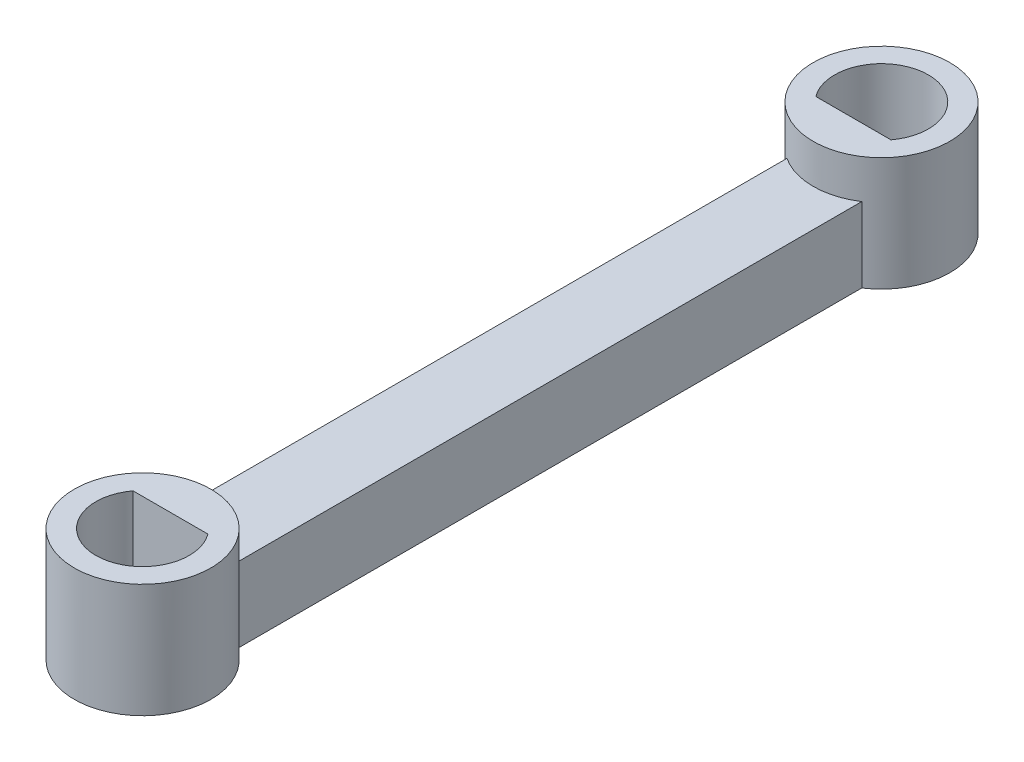
ISO-10303-21;
HEADER;
FILE_DESCRIPTION(('STEP AP214'),'2;1');
FILE_NAME('part.step','',(''),(''),'','','');
FILE_SCHEMA(('AUTOMOTIVE_DESIGN { 1 0 10303 214 1 1 1 1 }'));
ENDSEC;
DATA;
#1=APPLICATION_CONTEXT('core data for automotive mechanical design processes');
#2=APPLICATION_PROTOCOL_DEFINITION('international standard','automotive_design',2000,#1);
#3=PRODUCT_CONTEXT('',#1,'mechanical');
#4=PRODUCT('Part','Part','',(#3));
#5=PRODUCT_RELATED_PRODUCT_CATEGORY('part','',(#4));
#6=PRODUCT_DEFINITION_FORMATION('','',#4);
#7=PRODUCT_DEFINITION_CONTEXT('part definition',#1,'design');
#8=PRODUCT_DEFINITION('design','',#6,#7);
#9=PRODUCT_DEFINITION_SHAPE('','',#8);
#10=(LENGTH_UNIT() NAMED_UNIT(*) SI_UNIT(.MILLI.,.METRE.));
#11=(NAMED_UNIT(*) PLANE_ANGLE_UNIT() SI_UNIT($,.RADIAN.));
#12=(NAMED_UNIT(*) SI_UNIT($,.STERADIAN.) SOLID_ANGLE_UNIT());
#13=UNCERTAINTY_MEASURE_WITH_UNIT(LENGTH_MEASURE(1.E-05),#10,'distance_accuracy_value','');
#14=(GEOMETRIC_REPRESENTATION_CONTEXT(3) GLOBAL_UNCERTAINTY_ASSIGNED_CONTEXT((#13)) GLOBAL_UNIT_ASSIGNED_CONTEXT((#10,
#11,#12)) REPRESENTATION_CONTEXT('',''));
#15=CARTESIAN_POINT('',(0.,0.,0.));
#16=DIRECTION('',(0.,0.,1.));
#17=DIRECTION('',(1.,0.,0.));
#18=AXIS2_PLACEMENT_3D('',#15,#16,#17);
#19=CARTESIAN_POINT('',(0.,10.,0.));
#20=DIRECTION('',(0.,1.,0.));
#21=DIRECTION('',(0.,0.,1.));
#22=AXIS2_PLACEMENT_3D('',#19,#20,#21);
#23=PLANE('',#22);
#24=CARTESIAN_POINT('',(0.,10.,0.));
#25=DIRECTION('',(0.,1.,0.));
#26=DIRECTION('',(0.,0.,1.));
#27=AXIS2_PLACEMENT_3D('',#24,#25,#26);
#28=CIRCLE('',#27,6.);
#29=CARTESIAN_POINT('',(0.,10.,6.));
#30=VERTEX_POINT('',#29);
#31=EDGE_CURVE('E40',#30,#30,#28,.T.);
#32=ORIENTED_EDGE('',*,*,#31,.T.);
#33=EDGE_LOOP('',(#32));
#34=FACE_BOUND('',#33,.T.);
#35=DIRECTION('',(-1.,0.,0.));
#36=VECTOR('',#35,1.);
#37=CARTESIAN_POINT('',(-3.28747623565555,10.,-2.45));
#38=LINE('',#37,#36);
#39=CARTESIAN_POINT('',(3.28747623565555,10.,-2.45));
#40=VERTEX_POINT('',#39);
#41=CARTESIAN_POINT('',(-3.28747623565555,10.,-2.45));
#42=VERTEX_POINT('',#41);
#43=EDGE_CURVE('E147',#40,#42,#38,.T.);
#44=ORIENTED_EDGE('',*,*,#43,.F.);
#45=CARTESIAN_POINT('',(0.,10.,0.));
#46=DIRECTION('',(0.,1.,0.));
#47=DIRECTION('',(0.,0.,1.));
#48=AXIS2_PLACEMENT_3D('',#45,#46,#47);
#49=CIRCLE('',#48,4.1);
#50=EDGE_CURVE('E144',#42,#40,#49,.T.);
#51=ORIENTED_EDGE('',*,*,#50,.F.);
#52=EDGE_LOOP('',(#44,#51));
#53=FACE_BOUND('',#52,.T.);
#54=ADVANCED_FACE('F32',(#34,#53),#23,.T.);
#55=CARTESIAN_POINT('',(0.,0.,0.));
#56=DIRECTION('',(0.,1.,0.));
#57=DIRECTION('',(0.,0.,1.));
#58=AXIS2_PLACEMENT_3D('',#55,#56,#57);
#59=PLANE('',#58);
#60=DIRECTION('',(1.,0.,0.));
#61=VECTOR('',#60,1.);
#62=CARTESIAN_POINT('',(-3.29749905231222,0.,-62.43));
#63=LINE('',#62,#61);
#64=CARTESIAN_POINT('',(-3.29749905231222,0.,-62.43));
#65=VERTEX_POINT('',#64);
#66=CARTESIAN_POINT('',(3.29749905231222,0.,-62.43));
#67=VERTEX_POINT('',#66);
#68=EDGE_CURVE('E100',#65,#67,#63,.T.);
#69=ORIENTED_EDGE('',*,*,#68,.T.);
#70=CARTESIAN_POINT('',(0.,0.,-64.9));
#71=DIRECTION('',(0.,1.,0.));
#72=DIRECTION('',(0.,0.,1.));
#73=AXIS2_PLACEMENT_3D('',#70,#71,#72);
#74=CIRCLE('',#73,4.12);
#75=EDGE_CURVE('E47',#67,#65,#74,.T.);
#76=ORIENTED_EDGE('',*,*,#75,.T.);
#77=EDGE_LOOP('',(#69,#76));
#78=FACE_BOUND('',#77,.T.);
#79=DIRECTION('',(-1.,0.,0.));
#80=VECTOR('',#79,1.);
#81=CARTESIAN_POINT('',(-3.28747623565555,0.,-2.45));
#82=LINE('',#81,#80);
#83=CARTESIAN_POINT('',(3.28747623565555,0.,-2.45));
#84=VERTEX_POINT('',#83);
#85=CARTESIAN_POINT('',(-3.28747623565555,0.,-2.45));
#86=VERTEX_POINT('',#85);
#87=EDGE_CURVE('E148',#84,#86,#82,.T.);
#88=ORIENTED_EDGE('',*,*,#87,.T.);
#89=CARTESIAN_POINT('',(0.,0.,0.));
#90=DIRECTION('',(0.,1.,0.));
#91=DIRECTION('',(0.,0.,1.));
#92=AXIS2_PLACEMENT_3D('',#89,#90,#91);
#93=CIRCLE('',#92,4.1);
#94=EDGE_CURVE('E143',#86,#84,#93,.T.);
#95=ORIENTED_EDGE('',*,*,#94,.T.);
#96=EDGE_LOOP('',(#88,#95));
#97=FACE_BOUND('',#96,.T.);
#98=DIRECTION('',(0.,0.,1.));
#99=VECTOR('',#98,1.);
#100=CARTESIAN_POINT('',(-3.28747623565555,0.,-62.45));
#101=LINE('',#100,#99);
#102=CARTESIAN_POINT('',(-3.28747623565555,0.,-59.8807869142663));
#103=VERTEX_POINT('',#102);
#104=CARTESIAN_POINT('',(-3.28747623565555,0.,-5.01921308573366));
#105=VERTEX_POINT('',#104);
#106=EDGE_CURVE('E126',#103,#105,#101,.T.);
#107=ORIENTED_EDGE('',*,*,#106,.F.);
#108=CARTESIAN_POINT('',(0.,0.,-64.9));
#109=DIRECTION('',(0.,-1.,0.));
#110=DIRECTION('',(0.,0.,-1.));
#111=AXIS2_PLACEMENT_3D('',#108,#109,#110);
#112=CIRCLE('',#111,6.);
#113=CARTESIAN_POINT('',(3.28747623565555,0.,-59.8807869142663));
#114=VERTEX_POINT('',#113);
#115=EDGE_CURVE('E113',#103,#114,#112,.T.);
#116=ORIENTED_EDGE('',*,*,#115,.T.);
#117=DIRECTION('',(0.,0.,1.));
#118=VECTOR('',#117,1.);
#119=CARTESIAN_POINT('',(3.28747623565555,0.,-62.45));
#120=LINE('',#119,#118);
#121=CARTESIAN_POINT('',(3.28747623565555,0.,-5.01921308573366));
#122=VERTEX_POINT('',#121);
#123=EDGE_CURVE('E132',#114,#122,#120,.T.);
#124=ORIENTED_EDGE('',*,*,#123,.T.);
#125=CARTESIAN_POINT('',(0.,0.,0.));
#126=DIRECTION('',(0.,1.,0.));
#127=DIRECTION('',(0.,0.,1.));
#128=AXIS2_PLACEMENT_3D('',#125,#126,#127);
#129=CIRCLE('',#128,6.);
#130=EDGE_CURVE('E158',#105,#122,#129,.T.);
#131=ORIENTED_EDGE('',*,*,#130,.F.);
#132=EDGE_LOOP('',(#107,#116,#124,#131));
#133=FACE_BOUND('',#132,.T.);
#134=ADVANCED_FACE('F106',(#78,#97,#133),#59,.F.);
#135=CARTESIAN_POINT('',(0.,10.,0.));
#136=DIRECTION('',(0.,-1.,0.));
#137=DIRECTION('',(0.,0.,-1.));
#138=AXIS2_PLACEMENT_3D('',#135,#136,#137);
#139=CYLINDRICAL_SURFACE('',#138,6.);
#140=ORIENTED_EDGE('',*,*,#31,.F.);
#141=EDGE_LOOP('',(#140));
#142=FACE_BOUND('',#141,.T.);
#143=CARTESIAN_POINT('',(0.,6.57495247131111,0.));
#144=DIRECTION('',(0.,1.,0.));
#145=DIRECTION('',(0.,0.,1.));
#146=AXIS2_PLACEMENT_3D('',#143,#144,#145);
#147=CIRCLE('',#146,6.);
#148=CARTESIAN_POINT('',(3.28747623565555,6.57495247131111,-5.01921308573366));
#149=VERTEX_POINT('',#148);
#150=CARTESIAN_POINT('',(-3.28747623565555,6.57495247131111,-5.01921308573366));
#151=VERTEX_POINT('',#150);
#152=EDGE_CURVE('E137',#149,#151,#147,.T.);
#153=ORIENTED_EDGE('',*,*,#152,.T.);
#154=DIRECTION('',(0.,-1.,0.));
#155=VECTOR('',#154,1.);
#156=CARTESIAN_POINT('',(-3.28747623565555,10.,-5.01921308573366));
#157=LINE('',#156,#155);
#158=EDGE_CURVE('E140',#151,#105,#157,.T.);
#159=ORIENTED_EDGE('',*,*,#158,.T.);
#160=ORIENTED_EDGE('',*,*,#130,.T.);
#161=DIRECTION('',(0.,-1.,0.));
#162=VECTOR('',#161,1.);
#163=CARTESIAN_POINT('',(3.28747623565555,10.,-5.01921308573366));
#164=LINE('',#163,#162);
#165=EDGE_CURVE('E129',#122,#149,#164,.F.);
#166=ORIENTED_EDGE('',*,*,#165,.T.);
#167=EDGE_LOOP('',(#153,#159,#160,#166));
#168=FACE_BOUND('',#167,.T.);
#169=ADVANCED_FACE('F34',(#142,#168),#139,.T.);
#170=CARTESIAN_POINT('',(0.,10.,0.));
#171=DIRECTION('',(0.,-1.,0.));
#172=DIRECTION('',(0.,0.,-1.));
#173=AXIS2_PLACEMENT_3D('',#170,#171,#172);
#174=CYLINDRICAL_SURFACE('',#173,4.1);
#175=ORIENTED_EDGE('',*,*,#94,.F.);
#176=DIRECTION('',(0.,-1.,0.));
#177=VECTOR('',#176,1.);
#178=CARTESIAN_POINT('',(-3.28747623565555,10.,-2.45));
#179=LINE('',#178,#177);
#180=EDGE_CURVE('E150',#42,#86,#179,.T.);
#181=ORIENTED_EDGE('',*,*,#180,.F.);
#182=ORIENTED_EDGE('',*,*,#50,.T.);
#183=DIRECTION('',(0.,-1.,0.));
#184=VECTOR('',#183,1.);
#185=CARTESIAN_POINT('',(3.28747623565555,10.,-2.45));
#186=LINE('',#185,#184);
#187=EDGE_CURVE('E156',#40,#84,#186,.T.);
#188=ORIENTED_EDGE('',*,*,#187,.T.);
#189=EDGE_LOOP('',(#175,#181,#182,#188));
#190=FACE_BOUND('',#189,.T.);
#191=ADVANCED_FACE('F184',(#190),#174,.F.);
#192=CARTESIAN_POINT('',(-3.28747623565555,10.,-2.45));
#193=DIRECTION('',(0.,0.,1.));
#194=DIRECTION('',(1.,0.,0.));
#195=AXIS2_PLACEMENT_3D('',#192,#193,#194);
#196=PLANE('',#195);
#197=ORIENTED_EDGE('',*,*,#180,.T.);
#198=ORIENTED_EDGE('',*,*,#87,.F.);
#199=ORIENTED_EDGE('',*,*,#187,.F.);
#200=ORIENTED_EDGE('',*,*,#43,.T.);
#201=EDGE_LOOP('',(#197,#198,#199,#200));
#202=FACE_BOUND('',#201,.T.);
#203=ADVANCED_FACE('F191',(#202),#196,.T.);
#204=CARTESIAN_POINT('',(-3.28747623565555,6.57495247131111,-62.45));
#205=DIRECTION('',(-1.,0.,0.));
#206=DIRECTION('',(0.,0.,1.));
#207=AXIS2_PLACEMENT_3D('',#204,#205,#206);
#208=PLANE('',#207);
#209=DIRECTION('',(0.,-1.,0.));
#210=VECTOR('',#209,1.);
#211=CARTESIAN_POINT('',(-3.28747623565555,10.,-59.8807869142663));
#212=LINE('',#211,#210);
#213=CARTESIAN_POINT('',(-3.28747623565555,6.57495247131111,-59.8807869142663));
#214=VERTEX_POINT('',#213);
#215=EDGE_CURVE('E123',#103,#214,#212,.F.);
#216=ORIENTED_EDGE('',*,*,#215,.F.);
#217=ORIENTED_EDGE('',*,*,#106,.T.);
#218=ORIENTED_EDGE('',*,*,#158,.F.);
#219=DIRECTION('',(0.,0.,1.));
#220=VECTOR('',#219,1.);
#221=CARTESIAN_POINT('',(-3.28747623565555,6.57495247131111,-62.45));
#222=LINE('',#221,#220);
#223=EDGE_CURVE('E127',#214,#151,#222,.T.);
#224=ORIENTED_EDGE('',*,*,#223,.F.);
#225=EDGE_LOOP('',(#216,#217,#218,#224));
#226=FACE_BOUND('',#225,.T.);
#227=ADVANCED_FACE('F178',(#226),#208,.T.);
#228=CARTESIAN_POINT('',(-3.28747623565555,6.57495247131111,-62.45));
#229=DIRECTION('',(0.,1.,0.));
#230=DIRECTION('',(0.,0.,1.));
#231=AXIS2_PLACEMENT_3D('',#228,#229,#230);
#232=PLANE('',#231);
#233=CARTESIAN_POINT('',(0.,6.57495247131111,-64.9));
#234=DIRECTION('',(0.,1.,0.));
#235=DIRECTION('',(0.,0.,1.));
#236=AXIS2_PLACEMENT_3D('',#233,#234,#235);
#237=CIRCLE('',#236,6.);
#238=CARTESIAN_POINT('',(3.28747623565555,6.57495247131111,-59.8807869142663));
#239=VERTEX_POINT('',#238);
#240=EDGE_CURVE('E118',#214,#239,#237,.T.);
#241=ORIENTED_EDGE('',*,*,#240,.F.);
#242=ORIENTED_EDGE('',*,*,#223,.T.);
#243=ORIENTED_EDGE('',*,*,#152,.F.);
#244=DIRECTION('',(0.,0.,1.));
#245=VECTOR('',#244,1.);
#246=CARTESIAN_POINT('',(3.28747623565555,6.57495247131111,-62.45));
#247=LINE('',#246,#245);
#248=EDGE_CURVE('E130',#239,#149,#247,.T.);
#249=ORIENTED_EDGE('',*,*,#248,.F.);
#250=EDGE_LOOP('',(#241,#242,#243,#249));
#251=FACE_BOUND('',#250,.T.);
#252=ADVANCED_FACE('F172',(#251),#232,.T.);
#253=CARTESIAN_POINT('',(3.28747623565555,6.57495247131111,-62.45));
#254=DIRECTION('',(1.,0.,0.));
#255=DIRECTION('',(0.,0.,-1.));
#256=AXIS2_PLACEMENT_3D('',#253,#254,#255);
#257=PLANE('',#256);
#258=DIRECTION('',(0.,-1.,0.));
#259=VECTOR('',#258,1.);
#260=CARTESIAN_POINT('',(3.28747623565555,10.,-59.8807869142663));
#261=LINE('',#260,#259);
#262=EDGE_CURVE('E11',#239,#114,#261,.T.);
#263=ORIENTED_EDGE('',*,*,#262,.F.);
#264=ORIENTED_EDGE('',*,*,#248,.T.);
#265=ORIENTED_EDGE('',*,*,#165,.F.);
#266=ORIENTED_EDGE('',*,*,#123,.F.);
#267=EDGE_LOOP('',(#263,#264,#265,#266));
#268=FACE_BOUND('',#267,.T.);
#269=ADVANCED_FACE('F169',(#268),#257,.T.);
#270=CARTESIAN_POINT('',(0.,10.,-64.9));
#271=DIRECTION('',(0.,-1.,0.));
#272=DIRECTION('',(0.,0.,-1.));
#273=AXIS2_PLACEMENT_3D('',#270,#271,#272);
#274=CYLINDRICAL_SURFACE('',#273,6.);
#275=CARTESIAN_POINT('',(0.,10.,-64.9));
#276=DIRECTION('',(0.,-1.,0.));
#277=DIRECTION('',(0.,0.,-1.));
#278=AXIS2_PLACEMENT_3D('',#275,#276,#277);
#279=CIRCLE('',#278,6.);
#280=CARTESIAN_POINT('',(0.,10.,-70.9));
#281=VERTEX_POINT('',#280);
#282=EDGE_CURVE('E115',#281,#281,#279,.T.);
#283=ORIENTED_EDGE('',*,*,#282,.T.);
#284=EDGE_LOOP('',(#283));
#285=FACE_BOUND('',#284,.T.);
#286=ORIENTED_EDGE('',*,*,#115,.F.);
#287=ORIENTED_EDGE('',*,*,#215,.T.);
#288=ORIENTED_EDGE('',*,*,#240,.T.);
#289=ORIENTED_EDGE('',*,*,#262,.T.);
#290=EDGE_LOOP('',(#286,#287,#288,#289));
#291=FACE_BOUND('',#290,.T.);
#292=ADVANCED_FACE('F176',(#285,#291),#274,.T.);
#293=CARTESIAN_POINT('',(0.,10.,-64.9));
#294=DIRECTION('',(0.,1.,0.));
#295=DIRECTION('',(0.,0.,-1.));
#296=AXIS2_PLACEMENT_3D('',#293,#294,#295);
#297=PLANE('',#296);
#298=CARTESIAN_POINT('',(0.,10.,-64.9));
#299=DIRECTION('',(0.,1.,0.));
#300=DIRECTION('',(0.,0.,1.));
#301=AXIS2_PLACEMENT_3D('',#298,#299,#300);
#302=CIRCLE('',#301,4.12);
#303=CARTESIAN_POINT('',(3.29749905231222,10.,-62.43));
#304=VERTEX_POINT('',#303);
#305=CARTESIAN_POINT('',(-3.29749905231222,10.,-62.43));
#306=VERTEX_POINT('',#305);
#307=EDGE_CURVE('E52',#304,#306,#302,.T.);
#308=ORIENTED_EDGE('',*,*,#307,.F.);
#309=DIRECTION('',(1.,0.,0.));
#310=VECTOR('',#309,1.);
#311=CARTESIAN_POINT('',(-3.29749905231222,10.,-62.43));
#312=LINE('',#311,#310);
#313=EDGE_CURVE('E108',#306,#304,#312,.T.);
#314=ORIENTED_EDGE('',*,*,#313,.F.);
#315=EDGE_LOOP('',(#308,#314));
#316=FACE_BOUND('',#315,.T.);
#317=ORIENTED_EDGE('',*,*,#282,.F.);
#318=EDGE_LOOP('',(#317));
#319=FACE_BOUND('',#318,.T.);
#320=ADVANCED_FACE('F204',(#316,#319),#297,.T.);
#321=CARTESIAN_POINT('',(0.,0.,-64.9));
#322=DIRECTION('',(0.,1.,0.));
#323=DIRECTION('',(0.,0.,1.));
#324=AXIS2_PLACEMENT_3D('',#321,#322,#323);
#325=CYLINDRICAL_SURFACE('',#324,4.12);
#326=ORIENTED_EDGE('',*,*,#307,.T.);
#327=DIRECTION('',(0.,1.,0.));
#328=VECTOR('',#327,1.);
#329=CARTESIAN_POINT('',(-3.29749905231222,0.,-62.43));
#330=LINE('',#329,#328);
#331=EDGE_CURVE('E93',#65,#306,#330,.T.);
#332=ORIENTED_EDGE('',*,*,#331,.F.);
#333=ORIENTED_EDGE('',*,*,#75,.F.);
#334=DIRECTION('',(0.,1.,0.));
#335=VECTOR('',#334,1.);
#336=CARTESIAN_POINT('',(3.29749905231222,0.,-62.43));
#337=LINE('',#336,#335);
#338=EDGE_CURVE('E99',#67,#304,#337,.T.);
#339=ORIENTED_EDGE('',*,*,#338,.T.);
#340=EDGE_LOOP('',(#326,#332,#333,#339));
#341=FACE_BOUND('',#340,.T.);
#342=ADVANCED_FACE('F95',(#341),#325,.F.);
#343=CARTESIAN_POINT('',(-3.29749905231222,0.,-62.43));
#344=DIRECTION('',(0.,0.,1.));
#345=DIRECTION('',(1.,0.,0.));
#346=AXIS2_PLACEMENT_3D('',#343,#344,#345);
#347=PLANE('',#346);
#348=ORIENTED_EDGE('',*,*,#313,.T.);
#349=ORIENTED_EDGE('',*,*,#338,.F.);
#350=ORIENTED_EDGE('',*,*,#68,.F.);
#351=ORIENTED_EDGE('',*,*,#331,.T.);
#352=EDGE_LOOP('',(#348,#349,#350,#351));
#353=FACE_BOUND('',#352,.T.);
#354=ADVANCED_FACE('F103',(#353),#347,.F.);
#355=CLOSED_SHELL('',(#54,#134,#169,#191,#203,#227,#252,#269,#292,#320,#342,#354));
#356=MANIFOLD_SOLID_BREP('B2',#355);
#357=ADVANCED_BREP_SHAPE_REPRESENTATION('',(#18,#356),#14);
#358=SHAPE_DEFINITION_REPRESENTATION(#9,#357);
ENDSEC;
END-ISO-10303-21;
